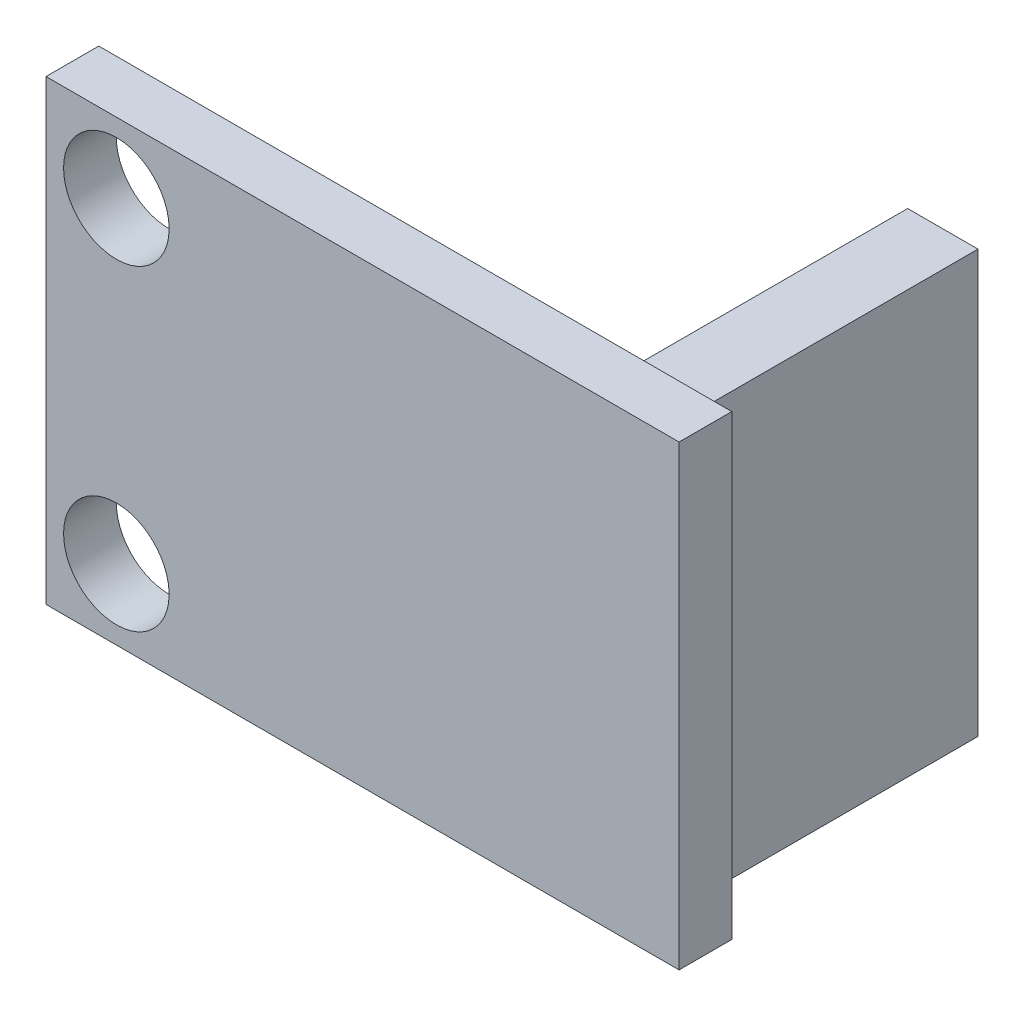
ISO-10303-21;
HEADER;
FILE_DESCRIPTION(('STEP AP214'),'2;1');
FILE_NAME('part.step','',(''),(''),'','','');
FILE_SCHEMA(('AUTOMOTIVE_DESIGN { 1 0 10303 214 1 1 1 1 }'));
ENDSEC;
DATA;
#1=APPLICATION_CONTEXT('core data for automotive mechanical design processes');
#2=APPLICATION_PROTOCOL_DEFINITION('international standard','automotive_design',2000,#1);
#3=PRODUCT_CONTEXT('',#1,'mechanical');
#4=PRODUCT('Part','Part','',(#3));
#5=PRODUCT_RELATED_PRODUCT_CATEGORY('part','',(#4));
#6=PRODUCT_DEFINITION_FORMATION('','',#4);
#7=PRODUCT_DEFINITION_CONTEXT('part definition',#1,'design');
#8=PRODUCT_DEFINITION('design','',#6,#7);
#9=PRODUCT_DEFINITION_SHAPE('','',#8);
#10=(LENGTH_UNIT() NAMED_UNIT(*) SI_UNIT(.MILLI.,.METRE.));
#11=(NAMED_UNIT(*) PLANE_ANGLE_UNIT() SI_UNIT($,.RADIAN.));
#12=(NAMED_UNIT(*) SI_UNIT($,.STERADIAN.) SOLID_ANGLE_UNIT());
#13=UNCERTAINTY_MEASURE_WITH_UNIT(LENGTH_MEASURE(1.E-05),#10,'distance_accuracy_value','');
#14=(GEOMETRIC_REPRESENTATION_CONTEXT(3) GLOBAL_UNCERTAINTY_ASSIGNED_CONTEXT((#13)) GLOBAL_UNIT_ASSIGNED_CONTEXT((#10,
#11,#12)) REPRESENTATION_CONTEXT('',''));
#15=CARTESIAN_POINT('',(0.,0.,0.));
#16=DIRECTION('',(0.,0.,1.));
#17=DIRECTION('',(1.,0.,0.));
#18=AXIS2_PLACEMENT_3D('',#15,#16,#17);
#19=CARTESIAN_POINT('',(0.,0.,0.));
#20=DIRECTION('',(0.,0.,-1.));
#21=DIRECTION('',(-1.,0.,0.));
#22=AXIS2_PLACEMENT_3D('',#19,#20,#21);
#23=PLANE('',#22);
#24=CARTESIAN_POINT('',(-7.,-4.5,0.));
#25=DIRECTION('',(0.,0.,1.));
#26=DIRECTION('',(-1.,0.,0.));
#27=AXIS2_PLACEMENT_3D('',#24,#25,#26);
#28=CIRCLE('',#27,1.5);
#29=CARTESIAN_POINT('',(-8.5,-4.5,0.));
#30=VERTEX_POINT('',#29);
#31=EDGE_CURVE('E203',#30,#30,#28,.T.);
#32=ORIENTED_EDGE('',*,*,#31,.T.);
#33=EDGE_LOOP('',(#32));
#34=FACE_BOUND('',#33,.T.);
#35=CARTESIAN_POINT('',(-7.,4.5,0.));
#36=DIRECTION('',(0.,0.,-1.));
#37=DIRECTION('',(-1.,0.,0.));
#38=AXIS2_PLACEMENT_3D('',#35,#36,#37);
#39=CIRCLE('',#38,1.5);
#40=CARTESIAN_POINT('',(-8.5,4.5,0.));
#41=VERTEX_POINT('',#40);
#42=EDGE_CURVE('E207',#41,#41,#39,.T.);
#43=ORIENTED_EDGE('',*,*,#42,.F.);
#44=EDGE_LOOP('',(#43));
#45=FACE_BOUND('',#44,.T.);
#46=DIRECTION('',(0.,1.,0.));
#47=VECTOR('',#46,1.);
#48=CARTESIAN_POINT('',(9.,-6.5,0.));
#49=LINE('',#48,#47);
#50=CARTESIAN_POINT('',(9.,-6.5,0.));
#51=VERTEX_POINT('',#50);
#52=CARTESIAN_POINT('',(9.,6.5,0.));
#53=VERTEX_POINT('',#52);
#54=EDGE_CURVE('E218',#51,#53,#49,.T.);
#55=ORIENTED_EDGE('',*,*,#54,.F.);
#56=DIRECTION('',(1.,0.,0.));
#57=VECTOR('',#56,1.);
#58=CARTESIAN_POINT('',(-9.,-6.5,0.));
#59=LINE('',#58,#57);
#60=CARTESIAN_POINT('',(-9.,-6.5,0.));
#61=VERTEX_POINT('',#60);
#62=EDGE_CURVE('E224',#61,#51,#59,.T.);
#63=ORIENTED_EDGE('',*,*,#62,.F.);
#64=DIRECTION('',(0.,-1.,0.));
#65=VECTOR('',#64,1.);
#66=CARTESIAN_POINT('',(-9.,-6.5,0.));
#67=LINE('',#66,#65);
#68=CARTESIAN_POINT('',(-9.,6.5,0.));
#69=VERTEX_POINT('',#68);
#70=EDGE_CURVE('E240',#69,#61,#67,.T.);
#71=ORIENTED_EDGE('',*,*,#70,.F.);
#72=DIRECTION('',(-1.,0.,0.));
#73=VECTOR('',#72,1.);
#74=CARTESIAN_POINT('',(-9.,6.5,0.));
#75=LINE('',#74,#73);
#76=EDGE_CURVE('E237',#53,#69,#75,.T.);
#77=ORIENTED_EDGE('',*,*,#76,.F.);
#78=EDGE_LOOP('',(#55,#63,#71,#77));
#79=FACE_BOUND('',#78,.T.);
#80=DIRECTION('',(-1.,0.,0.));
#81=VECTOR('',#80,1.);
#82=CARTESIAN_POINT('',(7.99999999999999,-6.,0.));
#83=LINE('',#82,#81);
#84=CARTESIAN_POINT('',(7.99999999999999,-6.,0.));
#85=VERTEX_POINT('',#84);
#86=CARTESIAN_POINT('',(5.99999999999999,-6.,0.));
#87=VERTEX_POINT('',#86);
#88=EDGE_CURVE('E163',#85,#87,#83,.T.);
#89=ORIENTED_EDGE('',*,*,#88,.F.);
#90=DIRECTION('',(0.,-1.,0.));
#91=VECTOR('',#90,1.);
#92=CARTESIAN_POINT('',(7.99999999999999,6.,0.));
#93=LINE('',#92,#91);
#94=CARTESIAN_POINT('',(7.99999999999999,6.,0.));
#95=VERTEX_POINT('',#94);
#96=EDGE_CURVE('E158',#95,#85,#93,.T.);
#97=ORIENTED_EDGE('',*,*,#96,.F.);
#98=DIRECTION('',(1.,0.,0.));
#99=VECTOR('',#98,1.);
#100=CARTESIAN_POINT('',(7.99999999999999,6.,0.));
#101=LINE('',#100,#99);
#102=CARTESIAN_POINT('',(5.99999999999999,6.,0.));
#103=VERTEX_POINT('',#102);
#104=EDGE_CURVE('E173',#103,#95,#101,.T.);
#105=ORIENTED_EDGE('',*,*,#104,.F.);
#106=DIRECTION('',(0.,1.,0.));
#107=VECTOR('',#106,1.);
#108=CARTESIAN_POINT('',(5.99999999999999,6.,0.));
#109=LINE('',#108,#107);
#110=EDGE_CURVE('E185',#87,#103,#109,.T.);
#111=ORIENTED_EDGE('',*,*,#110,.F.);
#112=EDGE_LOOP('',(#89,#97,#105,#111));
#113=FACE_BOUND('',#112,.T.);
#114=DIRECTION('',(-1.,0.,0.));
#115=VECTOR('',#114,1.);
#116=CARTESIAN_POINT('',(0.999999999999998,-1.5,0.));
#117=LINE('',#116,#115);
#118=CARTESIAN_POINT('',(0.999999999999998,-1.5,0.));
#119=VERTEX_POINT('',#118);
#120=CARTESIAN_POINT('',(-2.,-1.5,0.));
#121=VERTEX_POINT('',#120);
#122=EDGE_CURVE('E450',#119,#121,#117,.T.);
#123=ORIENTED_EDGE('',*,*,#122,.F.);
#124=DIRECTION('',(0.,-1.,0.));
#125=VECTOR('',#124,1.);
#126=CARTESIAN_POINT('',(0.999999999999998,1.5,0.));
#127=LINE('',#126,#125);
#128=CARTESIAN_POINT('',(0.999999999999998,1.5,0.));
#129=VERTEX_POINT('',#128);
#130=EDGE_CURVE('E155',#129,#119,#127,.T.);
#131=ORIENTED_EDGE('',*,*,#130,.F.);
#132=DIRECTION('',(1.,0.,0.));
#133=VECTOR('',#132,1.);
#134=CARTESIAN_POINT('',(0.999999999999998,1.5,0.));
#135=LINE('',#134,#133);
#136=CARTESIAN_POINT('',(-2.,1.5,0.));
#137=VERTEX_POINT('',#136);
#138=EDGE_CURVE('E151',#137,#129,#135,.T.);
#139=ORIENTED_EDGE('',*,*,#138,.F.);
#140=DIRECTION('',(0.,1.,0.));
#141=VECTOR('',#140,1.);
#142=CARTESIAN_POINT('',(-2.,1.5,0.));
#143=LINE('',#142,#141);
#144=EDGE_CURVE('E446',#121,#137,#143,.T.);
#145=ORIENTED_EDGE('',*,*,#144,.F.);
#146=EDGE_LOOP('',(#123,#131,#139,#145));
#147=FACE_BOUND('',#146,.T.);
#148=ADVANCED_FACE('F39',(#34,#45,#79,#113,#147),#23,.T.);
#149=CARTESIAN_POINT('',(9.,-6.5,1.5));
#150=DIRECTION('',(-1.,0.,0.));
#151=DIRECTION('',(0.,0.,1.));
#152=AXIS2_PLACEMENT_3D('',#149,#150,#151);
#153=PLANE('',#152);
#154=ORIENTED_EDGE('',*,*,#54,.T.);
#155=DIRECTION('',(0.,0.,-1.));
#156=VECTOR('',#155,1.);
#157=CARTESIAN_POINT('',(9.,6.5,1.5));
#158=LINE('',#157,#156);
#159=CARTESIAN_POINT('',(9.,6.5,1.5));
#160=VERTEX_POINT('',#159);
#161=EDGE_CURVE('E11',#160,#53,#158,.T.);
#162=ORIENTED_EDGE('',*,*,#161,.F.);
#163=DIRECTION('',(0.,1.,0.));
#164=VECTOR('',#163,1.);
#165=CARTESIAN_POINT('',(9.,-6.5,1.5));
#166=LINE('',#165,#164);
#167=CARTESIAN_POINT('',(9.,-6.5,1.5));
#168=VERTEX_POINT('',#167);
#169=EDGE_CURVE('E219',#168,#160,#166,.T.);
#170=ORIENTED_EDGE('',*,*,#169,.F.);
#171=DIRECTION('',(0.,0.,-1.));
#172=VECTOR('',#171,1.);
#173=CARTESIAN_POINT('',(9.,-6.5,1.5));
#174=LINE('',#173,#172);
#175=EDGE_CURVE('E233',#168,#51,#174,.T.);
#176=ORIENTED_EDGE('',*,*,#175,.T.);
#177=EDGE_LOOP('',(#154,#162,#170,#176));
#178=FACE_BOUND('',#177,.T.);
#179=ADVANCED_FACE('F41',(#178),#153,.F.);
#180=CARTESIAN_POINT('',(-9.,6.5,1.5));
#181=DIRECTION('',(0.,-1.,0.));
#182=DIRECTION('',(0.,0.,-1.));
#183=AXIS2_PLACEMENT_3D('',#180,#181,#182);
#184=PLANE('',#183);
#185=ORIENTED_EDGE('',*,*,#76,.T.);
#186=DIRECTION('',(0.,0.,-1.));
#187=VECTOR('',#186,1.);
#188=CARTESIAN_POINT('',(-9.,6.5,1.5));
#189=LINE('',#188,#187);
#190=CARTESIAN_POINT('',(-9.,6.5,1.5));
#191=VERTEX_POINT('',#190);
#192=EDGE_CURVE('E48',#191,#69,#189,.T.);
#193=ORIENTED_EDGE('',*,*,#192,.F.);
#194=DIRECTION('',(-1.,0.,0.));
#195=VECTOR('',#194,1.);
#196=CARTESIAN_POINT('',(-9.,6.5,1.5));
#197=LINE('',#196,#195);
#198=EDGE_CURVE('E223',#160,#191,#197,.T.);
#199=ORIENTED_EDGE('',*,*,#198,.F.);
#200=ORIENTED_EDGE('',*,*,#161,.T.);
#201=EDGE_LOOP('',(#185,#193,#199,#200));
#202=FACE_BOUND('',#201,.T.);
#203=ADVANCED_FACE('F273',(#202),#184,.F.);
#204=CARTESIAN_POINT('',(-9.,-6.5,1.5));
#205=DIRECTION('',(1.,0.,0.));
#206=DIRECTION('',(0.,0.,-1.));
#207=AXIS2_PLACEMENT_3D('',#204,#205,#206);
#208=PLANE('',#207);
#209=ORIENTED_EDGE('',*,*,#70,.T.);
#210=DIRECTION('',(0.,0.,-1.));
#211=VECTOR('',#210,1.);
#212=CARTESIAN_POINT('',(-9.,-6.5,1.5));
#213=LINE('',#212,#211);
#214=CARTESIAN_POINT('',(-9.,-6.5,1.5));
#215=VERTEX_POINT('',#214);
#216=EDGE_CURVE('E248',#215,#61,#213,.T.);
#217=ORIENTED_EDGE('',*,*,#216,.F.);
#218=DIRECTION('',(0.,-1.,0.));
#219=VECTOR('',#218,1.);
#220=CARTESIAN_POINT('',(-9.,-6.5,1.5));
#221=LINE('',#220,#219);
#222=EDGE_CURVE('E227',#191,#215,#221,.T.);
#223=ORIENTED_EDGE('',*,*,#222,.F.);
#224=ORIENTED_EDGE('',*,*,#192,.T.);
#225=EDGE_LOOP('',(#209,#217,#223,#224));
#226=FACE_BOUND('',#225,.T.);
#227=ADVANCED_FACE('F257',(#226),#208,.F.);
#228=CARTESIAN_POINT('',(-9.,-6.5,1.5));
#229=DIRECTION('',(0.,1.,0.));
#230=DIRECTION('',(0.,0.,1.));
#231=AXIS2_PLACEMENT_3D('',#228,#229,#230);
#232=PLANE('',#231);
#233=ORIENTED_EDGE('',*,*,#62,.T.);
#234=ORIENTED_EDGE('',*,*,#175,.F.);
#235=DIRECTION('',(1.,0.,0.));
#236=VECTOR('',#235,1.);
#237=CARTESIAN_POINT('',(-9.,-6.5,1.5));
#238=LINE('',#237,#236);
#239=EDGE_CURVE('E230',#215,#168,#238,.T.);
#240=ORIENTED_EDGE('',*,*,#239,.F.);
#241=ORIENTED_EDGE('',*,*,#216,.T.);
#242=EDGE_LOOP('',(#233,#234,#240,#241));
#243=FACE_BOUND('',#242,.T.);
#244=ADVANCED_FACE('F266',(#243),#232,.F.);
#245=CARTESIAN_POINT('',(0.,0.,1.5));
#246=DIRECTION('',(0.,0.,-1.));
#247=DIRECTION('',(-1.,0.,0.));
#248=AXIS2_PLACEMENT_3D('',#245,#246,#247);
#249=PLANE('',#248);
#250=CARTESIAN_POINT('',(-7.,-4.5,1.5));
#251=DIRECTION('',(0.,0.,-1.));
#252=DIRECTION('',(-1.,0.,0.));
#253=AXIS2_PLACEMENT_3D('',#250,#251,#252);
#254=CIRCLE('',#253,1.5);
#255=CARTESIAN_POINT('',(-8.5,-4.5,1.5));
#256=VERTEX_POINT('',#255);
#257=EDGE_CURVE('E202',#256,#256,#254,.T.);
#258=ORIENTED_EDGE('',*,*,#257,.T.);
#259=EDGE_LOOP('',(#258));
#260=FACE_BOUND('',#259,.T.);
#261=CARTESIAN_POINT('',(-7.,4.5,1.5));
#262=DIRECTION('',(0.,0.,-1.));
#263=DIRECTION('',(-1.,0.,0.));
#264=AXIS2_PLACEMENT_3D('',#261,#262,#263);
#265=CIRCLE('',#264,1.5);
#266=CARTESIAN_POINT('',(-8.5,4.5,1.5));
#267=VERTEX_POINT('',#266);
#268=EDGE_CURVE('E214',#267,#267,#265,.F.);
#269=ORIENTED_EDGE('',*,*,#268,.F.);
#270=EDGE_LOOP('',(#269));
#271=FACE_BOUND('',#270,.T.);
#272=ORIENTED_EDGE('',*,*,#169,.T.);
#273=ORIENTED_EDGE('',*,*,#198,.T.);
#274=ORIENTED_EDGE('',*,*,#222,.T.);
#275=ORIENTED_EDGE('',*,*,#239,.T.);
#276=EDGE_LOOP('',(#272,#273,#274,#275));
#277=FACE_BOUND('',#276,.T.);
#278=ADVANCED_FACE('F272',(#260,#271,#277),#249,.F.);
#279=CARTESIAN_POINT('',(-7.,4.5,1.501));
#280=DIRECTION('',(0.,0.,-1.));
#281=DIRECTION('',(-1.,0.,0.));
#282=AXIS2_PLACEMENT_3D('',#279,#280,#281);
#283=CYLINDRICAL_SURFACE('',#282,1.5);
#284=ORIENTED_EDGE('',*,*,#42,.T.);
#285=EDGE_LOOP('',(#284));
#286=FACE_BOUND('',#285,.T.);
#287=ORIENTED_EDGE('',*,*,#268,.T.);
#288=EDGE_LOOP('',(#287));
#289=FACE_BOUND('',#288,.T.);
#290=ADVANCED_FACE('F293',(#286,#289),#283,.F.);
#291=CARTESIAN_POINT('',(-7.,-4.5,1.501));
#292=DIRECTION('',(0.,0.,-1.));
#293=DIRECTION('',(-1.,0.,0.));
#294=AXIS2_PLACEMENT_3D('',#291,#292,#293);
#295=CYLINDRICAL_SURFACE('',#294,1.5);
#296=ORIENTED_EDGE('',*,*,#31,.F.);
#297=EDGE_LOOP('',(#296));
#298=FACE_BOUND('',#297,.T.);
#299=ORIENTED_EDGE('',*,*,#257,.F.);
#300=EDGE_LOOP('',(#299));
#301=FACE_BOUND('',#300,.T.);
#302=ADVANCED_FACE('F298',(#298,#301),#295,.F.);
#303=CARTESIAN_POINT('',(7.99999999999999,6.,-8.));
#304=DIRECTION('',(-1.,0.,0.));
#305=DIRECTION('',(0.,0.,1.));
#306=AXIS2_PLACEMENT_3D('',#303,#304,#305);
#307=PLANE('',#306);
#308=ORIENTED_EDGE('',*,*,#96,.T.);
#309=DIRECTION('',(0.,0.,1.));
#310=VECTOR('',#309,1.);
#311=CARTESIAN_POINT('',(7.99999999999999,-6.,-8.));
#312=LINE('',#311,#310);
#313=CARTESIAN_POINT('',(7.99999999999999,-6.,-8.));
#314=VERTEX_POINT('',#313);
#315=EDGE_CURVE('E199',#314,#85,#312,.T.);
#316=ORIENTED_EDGE('',*,*,#315,.F.);
#317=DIRECTION('',(0.,-1.,0.));
#318=VECTOR('',#317,1.);
#319=CARTESIAN_POINT('',(7.99999999999999,6.,-8.));
#320=LINE('',#319,#318);
#321=CARTESIAN_POINT('',(7.99999999999999,6.,-8.));
#322=VERTEX_POINT('',#321);
#323=EDGE_CURVE('E168',#322,#314,#320,.T.);
#324=ORIENTED_EDGE('',*,*,#323,.F.);
#325=DIRECTION('',(0.,0.,1.));
#326=VECTOR('',#325,1.);
#327=CARTESIAN_POINT('',(7.99999999999999,6.,-8.));
#328=LINE('',#327,#326);
#329=EDGE_CURVE('E181',#322,#95,#328,.T.);
#330=ORIENTED_EDGE('',*,*,#329,.T.);
#331=EDGE_LOOP('',(#308,#316,#324,#330));
#332=FACE_BOUND('',#331,.T.);
#333=ADVANCED_FACE('F306',(#332),#307,.F.);
#334=CARTESIAN_POINT('',(7.99999999999999,-6.,-8.));
#335=DIRECTION('',(0.,1.,0.));
#336=DIRECTION('',(0.,0.,1.));
#337=AXIS2_PLACEMENT_3D('',#334,#335,#336);
#338=PLANE('',#337);
#339=ORIENTED_EDGE('',*,*,#88,.T.);
#340=DIRECTION('',(0.,0.,1.));
#341=VECTOR('',#340,1.);
#342=CARTESIAN_POINT('',(5.99999999999999,-6.,-8.));
#343=LINE('',#342,#341);
#344=CARTESIAN_POINT('',(5.99999999999999,-6.,-8.));
#345=VERTEX_POINT('',#344);
#346=EDGE_CURVE('E195',#345,#87,#343,.T.);
#347=ORIENTED_EDGE('',*,*,#346,.F.);
#348=DIRECTION('',(-1.,0.,0.));
#349=VECTOR('',#348,1.);
#350=CARTESIAN_POINT('',(7.99999999999999,-6.,-8.));
#351=LINE('',#350,#349);
#352=EDGE_CURVE('E172',#314,#345,#351,.T.);
#353=ORIENTED_EDGE('',*,*,#352,.F.);
#354=ORIENTED_EDGE('',*,*,#315,.T.);
#355=EDGE_LOOP('',(#339,#347,#353,#354));
#356=FACE_BOUND('',#355,.T.);
#357=ADVANCED_FACE('F312',(#356),#338,.F.);
#358=CARTESIAN_POINT('',(5.99999999999999,6.,-8.));
#359=DIRECTION('',(1.,0.,0.));
#360=DIRECTION('',(0.,0.,-1.));
#361=AXIS2_PLACEMENT_3D('',#358,#359,#360);
#362=PLANE('',#361);
#363=ORIENTED_EDGE('',*,*,#110,.T.);
#364=DIRECTION('',(0.,0.,1.));
#365=VECTOR('',#364,1.);
#366=CARTESIAN_POINT('',(5.99999999999999,6.,-8.));
#367=LINE('',#366,#365);
#368=CARTESIAN_POINT('',(5.99999999999999,6.,-8.));
#369=VERTEX_POINT('',#368);
#370=EDGE_CURVE('E63',#369,#103,#367,.T.);
#371=ORIENTED_EDGE('',*,*,#370,.F.);
#372=DIRECTION('',(0.,1.,0.));
#373=VECTOR('',#372,1.);
#374=CARTESIAN_POINT('',(5.99999999999999,6.,-8.));
#375=LINE('',#374,#373);
#376=EDGE_CURVE('E176',#345,#369,#375,.T.);
#377=ORIENTED_EDGE('',*,*,#376,.F.);
#378=ORIENTED_EDGE('',*,*,#346,.T.);
#379=EDGE_LOOP('',(#363,#371,#377,#378));
#380=FACE_BOUND('',#379,.T.);
#381=ADVANCED_FACE('F319',(#380),#362,.F.);
#382=CARTESIAN_POINT('',(7.99999999999999,6.,-8.));
#383=DIRECTION('',(0.,-1.,0.));
#384=DIRECTION('',(0.,0.,-1.));
#385=AXIS2_PLACEMENT_3D('',#382,#383,#384);
#386=PLANE('',#385);
#387=ORIENTED_EDGE('',*,*,#104,.T.);
#388=ORIENTED_EDGE('',*,*,#329,.F.);
#389=DIRECTION('',(1.,0.,0.));
#390=VECTOR('',#389,1.);
#391=CARTESIAN_POINT('',(7.99999999999999,6.,-8.));
#392=LINE('',#391,#390);
#393=EDGE_CURVE('E179',#369,#322,#392,.T.);
#394=ORIENTED_EDGE('',*,*,#393,.F.);
#395=ORIENTED_EDGE('',*,*,#370,.T.);
#396=EDGE_LOOP('',(#387,#388,#394,#395));
#397=FACE_BOUND('',#396,.T.);
#398=ADVANCED_FACE('F323',(#397),#386,.F.);
#399=CARTESIAN_POINT('',(0.,0.,-8.));
#400=DIRECTION('',(0.,0.,-1.));
#401=DIRECTION('',(-1.,0.,0.));
#402=AXIS2_PLACEMENT_3D('',#399,#400,#401);
#403=PLANE('',#402);
#404=ORIENTED_EDGE('',*,*,#323,.T.);
#405=ORIENTED_EDGE('',*,*,#352,.T.);
#406=ORIENTED_EDGE('',*,*,#376,.T.);
#407=ORIENTED_EDGE('',*,*,#393,.T.);
#408=EDGE_LOOP('',(#404,#405,#406,#407));
#409=FACE_BOUND('',#408,.T.);
#410=ADVANCED_FACE('F327',(#409),#403,.T.);
#411=CARTESIAN_POINT('',(0.999999999999998,1.5,-1.));
#412=DIRECTION('',(-1.,0.,0.));
#413=DIRECTION('',(0.,0.,1.));
#414=AXIS2_PLACEMENT_3D('',#411,#412,#413);
#415=PLANE('',#414);
#416=ORIENTED_EDGE('',*,*,#130,.T.);
#417=DIRECTION('',(0.,0.,1.));
#418=VECTOR('',#417,1.);
#419=CARTESIAN_POINT('',(0.999999999999998,-1.5,-1.));
#420=LINE('',#419,#418);
#421=CARTESIAN_POINT('',(0.999999999999998,-1.5,-1.));
#422=VERTEX_POINT('',#421);
#423=EDGE_CURVE('E134',#422,#119,#420,.T.);
#424=ORIENTED_EDGE('',*,*,#423,.F.);
#425=DIRECTION('',(0.,-1.,0.));
#426=VECTOR('',#425,1.);
#427=CARTESIAN_POINT('',(0.999999999999998,1.5,-1.));
#428=LINE('',#427,#426);
#429=CARTESIAN_POINT('',(0.999999999999998,1.5,-1.));
#430=VERTEX_POINT('',#429);
#431=EDGE_CURVE('E142',#430,#422,#428,.T.);
#432=ORIENTED_EDGE('',*,*,#431,.F.);
#433=DIRECTION('',(0.,0.,1.));
#434=VECTOR('',#433,1.);
#435=CARTESIAN_POINT('',(0.999999999999998,1.5,-1.));
#436=LINE('',#435,#434);
#437=EDGE_CURVE('E442',#430,#129,#436,.T.);
#438=ORIENTED_EDGE('',*,*,#437,.T.);
#439=EDGE_LOOP('',(#416,#424,#432,#438));
#440=FACE_BOUND('',#439,.T.);
#441=ADVANCED_FACE('F153',(#440),#415,.F.);
#442=CARTESIAN_POINT('',(0.999999999999998,-1.5,-1.));
#443=DIRECTION('',(0.,1.,0.));
#444=DIRECTION('',(0.,0.,1.));
#445=AXIS2_PLACEMENT_3D('',#442,#443,#444);
#446=PLANE('',#445);
#447=ORIENTED_EDGE('',*,*,#122,.T.);
#448=DIRECTION('',(0.,0.,1.));
#449=VECTOR('',#448,1.);
#450=CARTESIAN_POINT('',(-2.,-1.5,-1.));
#451=LINE('',#450,#449);
#452=CARTESIAN_POINT('',(-2.,-1.5,-1.));
#453=VERTEX_POINT('',#452);
#454=EDGE_CURVE('E137',#453,#121,#451,.T.);
#455=ORIENTED_EDGE('',*,*,#454,.F.);
#456=DIRECTION('',(-1.,0.,0.));
#457=VECTOR('',#456,1.);
#458=CARTESIAN_POINT('',(0.999999999999998,-1.5,-1.));
#459=LINE('',#458,#457);
#460=EDGE_CURVE('E130',#422,#453,#459,.T.);
#461=ORIENTED_EDGE('',*,*,#460,.F.);
#462=ORIENTED_EDGE('',*,*,#423,.T.);
#463=EDGE_LOOP('',(#447,#455,#461,#462));
#464=FACE_BOUND('',#463,.T.);
#465=ADVANCED_FACE('F132',(#464),#446,.F.);
#466=CARTESIAN_POINT('',(-2.,1.5,-1.));
#467=DIRECTION('',(1.,0.,0.));
#468=DIRECTION('',(0.,0.,-1.));
#469=AXIS2_PLACEMENT_3D('',#466,#467,#468);
#470=PLANE('',#469);
#471=ORIENTED_EDGE('',*,*,#144,.T.);
#472=DIRECTION('',(0.,0.,1.));
#473=VECTOR('',#472,1.);
#474=CARTESIAN_POINT('',(-2.,1.5,-1.));
#475=LINE('',#474,#473);
#476=CARTESIAN_POINT('',(-2.,1.5,-1.));
#477=VERTEX_POINT('',#476);
#478=EDGE_CURVE('E55',#477,#137,#475,.T.);
#479=ORIENTED_EDGE('',*,*,#478,.F.);
#480=DIRECTION('',(0.,1.,0.));
#481=VECTOR('',#480,1.);
#482=CARTESIAN_POINT('',(-2.,1.5,-1.));
#483=LINE('',#482,#481);
#484=EDGE_CURVE('E141',#453,#477,#483,.T.);
#485=ORIENTED_EDGE('',*,*,#484,.F.);
#486=ORIENTED_EDGE('',*,*,#454,.T.);
#487=EDGE_LOOP('',(#471,#479,#485,#486));
#488=FACE_BOUND('',#487,.T.);
#489=ADVANCED_FACE('F335',(#488),#470,.F.);
#490=CARTESIAN_POINT('',(0.999999999999998,1.5,-1.));
#491=DIRECTION('',(0.,-1.,0.));
#492=DIRECTION('',(0.,0.,-1.));
#493=AXIS2_PLACEMENT_3D('',#490,#491,#492);
#494=PLANE('',#493);
#495=ORIENTED_EDGE('',*,*,#138,.T.);
#496=ORIENTED_EDGE('',*,*,#437,.F.);
#497=DIRECTION('',(1.,0.,0.));
#498=VECTOR('',#497,1.);
#499=CARTESIAN_POINT('',(0.999999999999998,1.5,-1.));
#500=LINE('',#499,#498);
#501=EDGE_CURVE('E146',#477,#430,#500,.T.);
#502=ORIENTED_EDGE('',*,*,#501,.F.);
#503=ORIENTED_EDGE('',*,*,#478,.T.);
#504=EDGE_LOOP('',(#495,#496,#502,#503));
#505=FACE_BOUND('',#504,.T.);
#506=ADVANCED_FACE('F338',(#505),#494,.F.);
#507=CARTESIAN_POINT('',(0.,0.,-1.));
#508=DIRECTION('',(0.,0.,-1.));
#509=DIRECTION('',(-1.,0.,0.));
#510=AXIS2_PLACEMENT_3D('',#507,#508,#509);
#511=PLANE('',#510);
#512=ORIENTED_EDGE('',*,*,#431,.T.);
#513=ORIENTED_EDGE('',*,*,#460,.T.);
#514=ORIENTED_EDGE('',*,*,#484,.T.);
#515=ORIENTED_EDGE('',*,*,#501,.T.);
#516=EDGE_LOOP('',(#512,#513,#514,#515));
#517=FACE_BOUND('',#516,.T.);
#518=ADVANCED_FACE('F145',(#517),#511,.T.);
#519=CLOSED_SHELL('',(#148,#179,#203,#227,#244,#278,#290,#302,#333,#357,#381,#398,#410,#441,
#465,#489,#506,#518));
#520=MANIFOLD_SOLID_BREP('B2',#519);
#521=ADVANCED_BREP_SHAPE_REPRESENTATION('',(#18,#520),#14);
#522=SHAPE_DEFINITION_REPRESENTATION(#9,#521);
ENDSEC;
END-ISO-10303-21;
